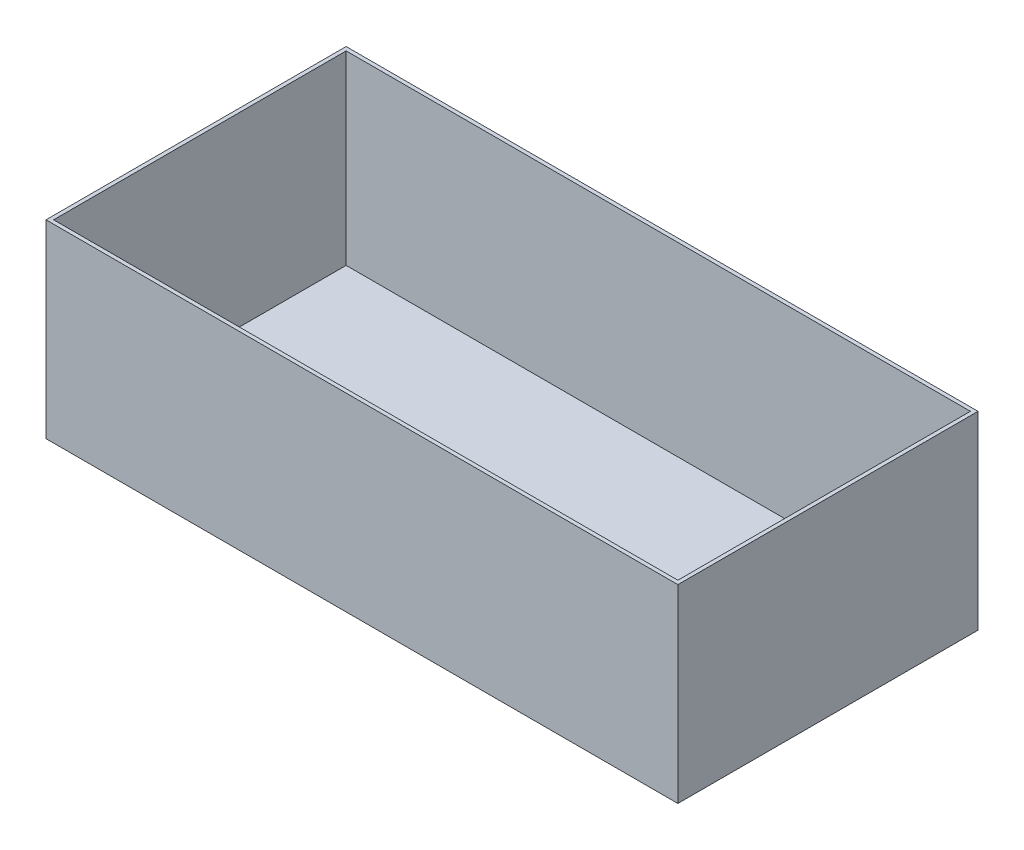
ISO-10303-21;
HEADER;
FILE_DESCRIPTION(('STEP AP214'),'2;1');
FILE_NAME('part.step','',(''),(''),'','','');
FILE_SCHEMA(('AUTOMOTIVE_DESIGN { 1 0 10303 214 1 1 1 1 }'));
ENDSEC;
DATA;
#1=APPLICATION_CONTEXT('core data for automotive mechanical design processes');
#2=APPLICATION_PROTOCOL_DEFINITION('international standard','automotive_design',2000,#1);
#3=PRODUCT_CONTEXT('',#1,'mechanical');
#4=PRODUCT('Part','Part','',(#3));
#5=PRODUCT_RELATED_PRODUCT_CATEGORY('part','',(#4));
#6=PRODUCT_DEFINITION_FORMATION('','',#4);
#7=PRODUCT_DEFINITION_CONTEXT('part definition',#1,'design');
#8=PRODUCT_DEFINITION('design','',#6,#7);
#9=PRODUCT_DEFINITION_SHAPE('','',#8);
#10=(LENGTH_UNIT() NAMED_UNIT(*) SI_UNIT(.MILLI.,.METRE.));
#11=(NAMED_UNIT(*) PLANE_ANGLE_UNIT() SI_UNIT($,.RADIAN.));
#12=(NAMED_UNIT(*) SI_UNIT($,.STERADIAN.) SOLID_ANGLE_UNIT());
#13=UNCERTAINTY_MEASURE_WITH_UNIT(LENGTH_MEASURE(1.E-05),#10,'distance_accuracy_value','');
#14=(GEOMETRIC_REPRESENTATION_CONTEXT(3) GLOBAL_UNCERTAINTY_ASSIGNED_CONTEXT((#13)) GLOBAL_UNIT_ASSIGNED_CONTEXT((#10,
#11,#12)) REPRESENTATION_CONTEXT('',''));
#15=CARTESIAN_POINT('',(0.,0.,0.));
#16=DIRECTION('',(0.,0.,1.));
#17=DIRECTION('',(1.,0.,0.));
#18=AXIS2_PLACEMENT_3D('',#15,#16,#17);
#19=CARTESIAN_POINT('',(0.,60.,0.));
#20=DIRECTION('',(1.,0.,0.));
#21=DIRECTION('',(0.,0.,-1.));
#22=AXIS2_PLACEMENT_3D('',#19,#20,#21);
#23=PLANE('',#22);
#24=DIRECTION('',(0.,0.,1.));
#25=VECTOR('',#24,1.);
#26=CARTESIAN_POINT('',(0.,0.,0.));
#27=LINE('',#26,#25);
#28=CARTESIAN_POINT('',(0.,0.,-95.));
#29=VERTEX_POINT('',#28);
#30=CARTESIAN_POINT('',(0.,0.,0.));
#31=VERTEX_POINT('',#30);
#32=EDGE_CURVE('E141',#29,#31,#27,.T.);
#33=ORIENTED_EDGE('',*,*,#32,.T.);
#34=DIRECTION('',(0.,-1.,0.));
#35=VECTOR('',#34,1.);
#36=CARTESIAN_POINT('',(0.,60.,0.));
#37=LINE('',#36,#35);
#38=CARTESIAN_POINT('',(0.,60.,0.));
#39=VERTEX_POINT('',#38);
#40=EDGE_CURVE('E11',#39,#31,#37,.T.);
#41=ORIENTED_EDGE('',*,*,#40,.F.);
#42=DIRECTION('',(0.,0.,1.));
#43=VECTOR('',#42,1.);
#44=CARTESIAN_POINT('',(0.,60.,0.));
#45=LINE('',#44,#43);
#46=CARTESIAN_POINT('',(0.,60.,-95.));
#47=VERTEX_POINT('',#46);
#48=EDGE_CURVE('E145',#47,#39,#45,.T.);
#49=ORIENTED_EDGE('',*,*,#48,.F.);
#50=DIRECTION('',(0.,-1.,0.));
#51=VECTOR('',#50,1.);
#52=CARTESIAN_POINT('',(0.,60.,-95.));
#53=LINE('',#52,#51);
#54=EDGE_CURVE('E151',#47,#29,#53,.T.);
#55=ORIENTED_EDGE('',*,*,#54,.T.);
#56=EDGE_LOOP('',(#33,#41,#49,#55));
#57=FACE_BOUND('',#56,.T.);
#58=ADVANCED_FACE('F33',(#57),#23,.F.);
#59=CARTESIAN_POINT('',(0.,60.,0.));
#60=DIRECTION('',(0.,0.,-1.));
#61=DIRECTION('',(-1.,0.,0.));
#62=AXIS2_PLACEMENT_3D('',#59,#60,#61);
#63=PLANE('',#62);
#64=DIRECTION('',(1.,0.,0.));
#65=VECTOR('',#64,1.);
#66=CARTESIAN_POINT('',(0.,0.,0.));
#67=LINE('',#66,#65);
#68=CARTESIAN_POINT('',(200.,0.,0.));
#69=VERTEX_POINT('',#68);
#70=EDGE_CURVE('E154',#31,#69,#67,.T.);
#71=ORIENTED_EDGE('',*,*,#70,.T.);
#72=DIRECTION('',(0.,-1.,0.));
#73=VECTOR('',#72,1.);
#74=CARTESIAN_POINT('',(200.,60.,0.));
#75=LINE('',#74,#73);
#76=CARTESIAN_POINT('',(200.,60.,0.));
#77=VERTEX_POINT('',#76);
#78=EDGE_CURVE('E40',#77,#69,#75,.T.);
#79=ORIENTED_EDGE('',*,*,#78,.F.);
#80=DIRECTION('',(1.,0.,0.));
#81=VECTOR('',#80,1.);
#82=CARTESIAN_POINT('',(0.,60.,0.));
#83=LINE('',#82,#81);
#84=EDGE_CURVE('E84',#39,#77,#83,.T.);
#85=ORIENTED_EDGE('',*,*,#84,.F.);
#86=ORIENTED_EDGE('',*,*,#40,.T.);
#87=EDGE_LOOP('',(#71,#79,#85,#86));
#88=FACE_BOUND('',#87,.T.);
#89=ADVANCED_FACE('F183',(#88),#63,.F.);
#90=CARTESIAN_POINT('',(200.,60.,0.));
#91=DIRECTION('',(-1.,0.,0.));
#92=DIRECTION('',(0.,0.,1.));
#93=AXIS2_PLACEMENT_3D('',#90,#91,#92);
#94=PLANE('',#93);
#95=DIRECTION('',(0.,0.,-1.));
#96=VECTOR('',#95,1.);
#97=CARTESIAN_POINT('',(200.,0.,0.));
#98=LINE('',#97,#96);
#99=CARTESIAN_POINT('',(200.,0.,-95.));
#100=VERTEX_POINT('',#99);
#101=EDGE_CURVE('E156',#69,#100,#98,.T.);
#102=ORIENTED_EDGE('',*,*,#101,.T.);
#103=DIRECTION('',(0.,-1.,0.));
#104=VECTOR('',#103,1.);
#105=CARTESIAN_POINT('',(200.,60.,-95.));
#106=LINE('',#105,#104);
#107=CARTESIAN_POINT('',(200.,60.,-95.));
#108=VERTEX_POINT('',#107);
#109=EDGE_CURVE('E160',#108,#100,#106,.T.);
#110=ORIENTED_EDGE('',*,*,#109,.F.);
#111=DIRECTION('',(0.,0.,-1.));
#112=VECTOR('',#111,1.);
#113=CARTESIAN_POINT('',(200.,60.,0.));
#114=LINE('',#113,#112);
#115=EDGE_CURVE('E148',#77,#108,#114,.T.);
#116=ORIENTED_EDGE('',*,*,#115,.F.);
#117=ORIENTED_EDGE('',*,*,#78,.T.);
#118=EDGE_LOOP('',(#102,#110,#116,#117));
#119=FACE_BOUND('',#118,.T.);
#120=ADVANCED_FACE('F165',(#119),#94,.F.);
#121=CARTESIAN_POINT('',(0.,60.,-95.));
#122=DIRECTION('',(0.,0.,1.));
#123=DIRECTION('',(1.,0.,0.));
#124=AXIS2_PLACEMENT_3D('',#121,#122,#123);
#125=PLANE('',#124);
#126=DIRECTION('',(-1.,0.,0.));
#127=VECTOR('',#126,1.);
#128=CARTESIAN_POINT('',(0.,0.,-95.));
#129=LINE('',#128,#127);
#130=EDGE_CURVE('E77',#100,#29,#129,.T.);
#131=ORIENTED_EDGE('',*,*,#130,.T.);
#132=ORIENTED_EDGE('',*,*,#54,.F.);
#133=DIRECTION('',(-1.,0.,0.));
#134=VECTOR('',#133,1.);
#135=CARTESIAN_POINT('',(0.,60.,-95.));
#136=LINE('',#135,#134);
#137=EDGE_CURVE('E56',#108,#47,#136,.T.);
#138=ORIENTED_EDGE('',*,*,#137,.F.);
#139=ORIENTED_EDGE('',*,*,#109,.T.);
#140=EDGE_LOOP('',(#131,#132,#138,#139));
#141=FACE_BOUND('',#140,.T.);
#142=ADVANCED_FACE('F173',(#141),#125,.F.);
#143=CARTESIAN_POINT('',(0.,60.,0.));
#144=DIRECTION('',(0.,-1.,0.));
#145=DIRECTION('',(0.,0.,-1.));
#146=AXIS2_PLACEMENT_3D('',#143,#144,#145);
#147=PLANE('',#146);
#148=DIRECTION('',(1.,0.,0.));
#149=VECTOR('',#148,1.);
#150=CARTESIAN_POINT('',(1.20000000000001,60.,-1.2));
#151=LINE('',#150,#149);
#152=CARTESIAN_POINT('',(1.20000000000001,60.,-1.2));
#153=VERTEX_POINT('',#152);
#154=CARTESIAN_POINT('',(198.8,60.,-1.2));
#155=VERTEX_POINT('',#154);
#156=EDGE_CURVE('E135',#153,#155,#151,.T.);
#157=ORIENTED_EDGE('',*,*,#156,.F.);
#158=DIRECTION('',(0.,0.,1.));
#159=VECTOR('',#158,1.);
#160=CARTESIAN_POINT('',(1.2,60.,-93.8));
#161=LINE('',#160,#159);
#162=CARTESIAN_POINT('',(1.2,60.,-93.8));
#163=VERTEX_POINT('',#162);
#164=EDGE_CURVE('E47',#163,#153,#161,.T.);
#165=ORIENTED_EDGE('',*,*,#164,.F.);
#166=DIRECTION('',(-1.,0.,0.));
#167=VECTOR('',#166,1.);
#168=CARTESIAN_POINT('',(1.2,60.,-93.8));
#169=LINE('',#168,#167);
#170=CARTESIAN_POINT('',(198.8,60.,-93.8));
#171=VERTEX_POINT('',#170);
#172=EDGE_CURVE('E126',#171,#163,#169,.T.);
#173=ORIENTED_EDGE('',*,*,#172,.F.);
#174=DIRECTION('',(0.,0.,-1.));
#175=VECTOR('',#174,1.);
#176=CARTESIAN_POINT('',(198.8,60.,-93.8));
#177=LINE('',#176,#175);
#178=EDGE_CURVE('E129',#155,#171,#177,.T.);
#179=ORIENTED_EDGE('',*,*,#178,.F.);
#180=EDGE_LOOP('',(#157,#165,#173,#179));
#181=FACE_BOUND('',#180,.T.);
#182=ORIENTED_EDGE('',*,*,#48,.T.);
#183=ORIENTED_EDGE('',*,*,#84,.T.);
#184=ORIENTED_EDGE('',*,*,#115,.T.);
#185=ORIENTED_EDGE('',*,*,#137,.T.);
#186=EDGE_LOOP('',(#182,#183,#184,#185));
#187=FACE_BOUND('',#186,.T.);
#188=ADVANCED_FACE('F175',(#181,#187),#147,.F.);
#189=CARTESIAN_POINT('',(0.,0.,0.));
#190=DIRECTION('',(0.,-1.,0.));
#191=DIRECTION('',(0.,0.,-1.));
#192=AXIS2_PLACEMENT_3D('',#189,#190,#191);
#193=PLANE('',#192);
#194=ORIENTED_EDGE('',*,*,#32,.F.);
#195=ORIENTED_EDGE('',*,*,#130,.F.);
#196=ORIENTED_EDGE('',*,*,#101,.F.);
#197=ORIENTED_EDGE('',*,*,#70,.F.);
#198=EDGE_LOOP('',(#194,#195,#196,#197));
#199=FACE_BOUND('',#198,.T.);
#200=ADVANCED_FACE('F169',(#199),#193,.T.);
#201=CARTESIAN_POINT('',(1.2,1.2,-93.8));
#202=DIRECTION('',(-1.,0.,0.));
#203=DIRECTION('',(0.,0.,1.));
#204=AXIS2_PLACEMENT_3D('',#201,#202,#203);
#205=PLANE('',#204);
#206=ORIENTED_EDGE('',*,*,#164,.T.);
#207=DIRECTION('',(0.,1.,0.));
#208=VECTOR('',#207,1.);
#209=CARTESIAN_POINT('',(1.20000000000001,1.2,-1.2));
#210=LINE('',#209,#208);
#211=CARTESIAN_POINT('',(1.20000000000001,1.2,-1.2));
#212=VERTEX_POINT('',#211);
#213=EDGE_CURVE('E104',#212,#153,#210,.T.);
#214=ORIENTED_EDGE('',*,*,#213,.F.);
#215=DIRECTION('',(0.,0.,1.));
#216=VECTOR('',#215,1.);
#217=CARTESIAN_POINT('',(1.2,1.2,-93.8));
#218=LINE('',#217,#216);
#219=CARTESIAN_POINT('',(1.2,1.2,-93.8));
#220=VERTEX_POINT('',#219);
#221=EDGE_CURVE('E108',#220,#212,#218,.T.);
#222=ORIENTED_EDGE('',*,*,#221,.F.);
#223=DIRECTION('',(0.,1.,0.));
#224=VECTOR('',#223,1.);
#225=CARTESIAN_POINT('',(1.2,1.2,-93.8));
#226=LINE('',#225,#224);
#227=EDGE_CURVE('E139',#220,#163,#226,.T.);
#228=ORIENTED_EDGE('',*,*,#227,.T.);
#229=EDGE_LOOP('',(#206,#214,#222,#228));
#230=FACE_BOUND('',#229,.T.);
#231=ADVANCED_FACE('F106',(#230),#205,.F.);
#232=CARTESIAN_POINT('',(1.2,1.2,-93.8));
#233=DIRECTION('',(0.,0.,-1.));
#234=DIRECTION('',(-1.,0.,0.));
#235=AXIS2_PLACEMENT_3D('',#232,#233,#234);
#236=PLANE('',#235);
#237=ORIENTED_EDGE('',*,*,#172,.T.);
#238=ORIENTED_EDGE('',*,*,#227,.F.);
#239=DIRECTION('',(-1.,0.,0.));
#240=VECTOR('',#239,1.);
#241=CARTESIAN_POINT('',(1.2,1.2,-93.8));
#242=LINE('',#241,#240);
#243=CARTESIAN_POINT('',(198.8,1.2,-93.8));
#244=VERTEX_POINT('',#243);
#245=EDGE_CURVE('E114',#244,#220,#242,.T.);
#246=ORIENTED_EDGE('',*,*,#245,.F.);
#247=DIRECTION('',(0.,1.,0.));
#248=VECTOR('',#247,1.);
#249=CARTESIAN_POINT('',(198.8,1.2,-93.8));
#250=LINE('',#249,#248);
#251=EDGE_CURVE('E142',#244,#171,#250,.T.);
#252=ORIENTED_EDGE('',*,*,#251,.T.);
#253=EDGE_LOOP('',(#237,#238,#246,#252));
#254=FACE_BOUND('',#253,.T.);
#255=ADVANCED_FACE('F222',(#254),#236,.F.);
#256=CARTESIAN_POINT('',(198.8,1.2,-93.8));
#257=DIRECTION('',(1.,0.,0.));
#258=DIRECTION('',(0.,0.,-1.));
#259=AXIS2_PLACEMENT_3D('',#256,#257,#258);
#260=PLANE('',#259);
#261=ORIENTED_EDGE('',*,*,#178,.T.);
#262=ORIENTED_EDGE('',*,*,#251,.F.);
#263=DIRECTION('',(0.,0.,-1.));
#264=VECTOR('',#263,1.);
#265=CARTESIAN_POINT('',(198.8,1.2,-93.8));
#266=LINE('',#265,#264);
#267=CARTESIAN_POINT('',(198.8,1.2,-1.2));
#268=VERTEX_POINT('',#267);
#269=EDGE_CURVE('E122',#268,#244,#266,.T.);
#270=ORIENTED_EDGE('',*,*,#269,.F.);
#271=DIRECTION('',(0.,1.,0.));
#272=VECTOR('',#271,1.);
#273=CARTESIAN_POINT('',(198.8,1.2,-1.2));
#274=LINE('',#273,#272);
#275=EDGE_CURVE('E113',#268,#155,#274,.T.);
#276=ORIENTED_EDGE('',*,*,#275,.T.);
#277=EDGE_LOOP('',(#261,#262,#270,#276));
#278=FACE_BOUND('',#277,.T.);
#279=ADVANCED_FACE('F231',(#278),#260,.F.);
#280=CARTESIAN_POINT('',(1.20000000000001,1.2,-1.2));
#281=DIRECTION('',(0.,0.,1.));
#282=DIRECTION('',(1.,0.,0.));
#283=AXIS2_PLACEMENT_3D('',#280,#281,#282);
#284=PLANE('',#283);
#285=ORIENTED_EDGE('',*,*,#156,.T.);
#286=ORIENTED_EDGE('',*,*,#275,.F.);
#287=DIRECTION('',(1.,0.,0.));
#288=VECTOR('',#287,1.);
#289=CARTESIAN_POINT('',(1.20000000000001,1.2,-1.2));
#290=LINE('',#289,#288);
#291=EDGE_CURVE('E117',#212,#268,#290,.T.);
#292=ORIENTED_EDGE('',*,*,#291,.F.);
#293=ORIENTED_EDGE('',*,*,#213,.T.);
#294=EDGE_LOOP('',(#285,#286,#292,#293));
#295=FACE_BOUND('',#294,.T.);
#296=ADVANCED_FACE('F118',(#295),#284,.F.);
#297=CARTESIAN_POINT('',(0.,1.2,0.));
#298=DIRECTION('',(0.,1.,0.));
#299=DIRECTION('',(0.,0.,1.));
#300=AXIS2_PLACEMENT_3D('',#297,#298,#299);
#301=PLANE('',#300);
#302=ORIENTED_EDGE('',*,*,#221,.T.);
#303=ORIENTED_EDGE('',*,*,#291,.T.);
#304=ORIENTED_EDGE('',*,*,#269,.T.);
#305=ORIENTED_EDGE('',*,*,#245,.T.);
#306=EDGE_LOOP('',(#302,#303,#304,#305));
#307=FACE_BOUND('',#306,.T.);
#308=ADVANCED_FACE('F124',(#307),#301,.T.);
#309=CLOSED_SHELL('',(#58,#89,#120,#142,#188,#200,#231,#255,#279,#296,#308));
#310=MANIFOLD_SOLID_BREP('B2',#309);
#311=ADVANCED_BREP_SHAPE_REPRESENTATION('',(#18,#310),#14);
#312=SHAPE_DEFINITION_REPRESENTATION(#9,#311);
ENDSEC;
END-ISO-10303-21;
